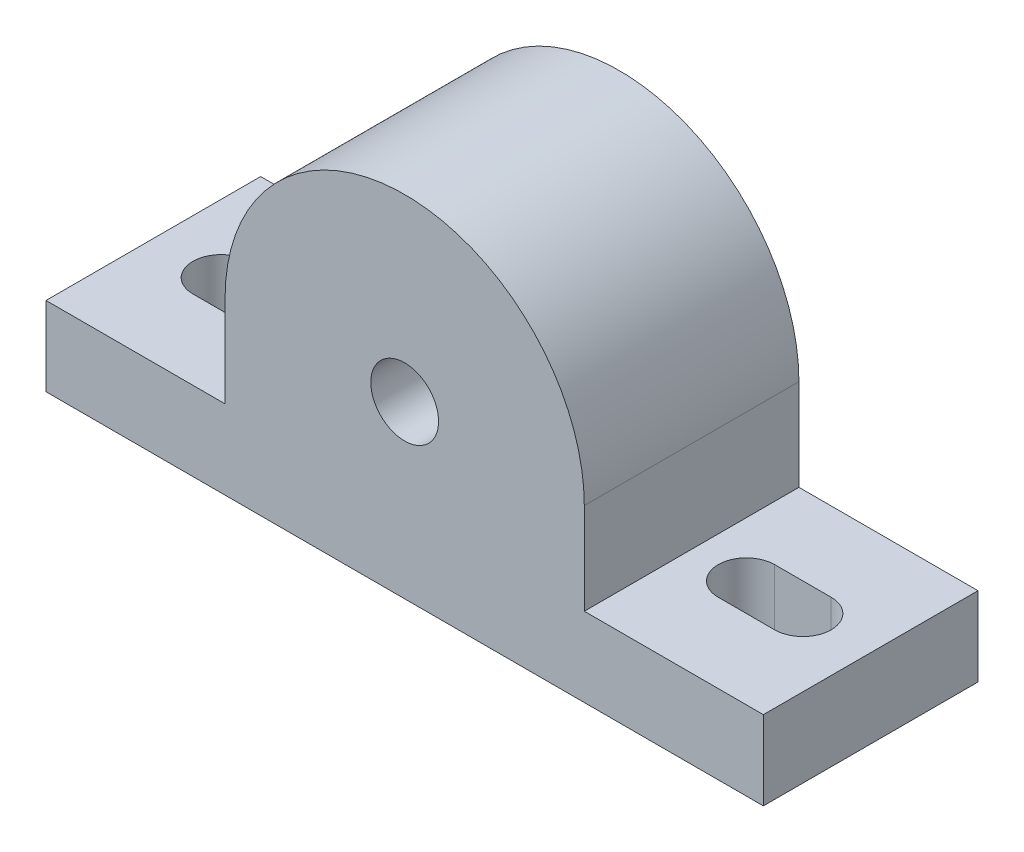
ISO-10303-21;
HEADER;
FILE_DESCRIPTION(('STEP AP214'),'2;1');
FILE_NAME('part.step','',(''),(''),'','','');
FILE_SCHEMA(('AUTOMOTIVE_DESIGN { 1 0 10303 214 1 1 1 1 }'));
ENDSEC;
DATA;
#1=APPLICATION_CONTEXT('core data for automotive mechanical design processes');
#2=APPLICATION_PROTOCOL_DEFINITION('international standard','automotive_design',2000,#1);
#3=PRODUCT_CONTEXT('',#1,'mechanical');
#4=PRODUCT('Part','Part','',(#3));
#5=PRODUCT_RELATED_PRODUCT_CATEGORY('part','',(#4));
#6=PRODUCT_DEFINITION_FORMATION('','',#4);
#7=PRODUCT_DEFINITION_CONTEXT('part definition',#1,'design');
#8=PRODUCT_DEFINITION('design','',#6,#7);
#9=PRODUCT_DEFINITION_SHAPE('','',#8);
#10=(LENGTH_UNIT() NAMED_UNIT(*) SI_UNIT(.MILLI.,.METRE.));
#11=(NAMED_UNIT(*) PLANE_ANGLE_UNIT() SI_UNIT($,.RADIAN.));
#12=(NAMED_UNIT(*) SI_UNIT($,.STERADIAN.) SOLID_ANGLE_UNIT());
#13=UNCERTAINTY_MEASURE_WITH_UNIT(LENGTH_MEASURE(1.E-05),#10,'distance_accuracy_value','');
#14=(GEOMETRIC_REPRESENTATION_CONTEXT(3) GLOBAL_UNCERTAINTY_ASSIGNED_CONTEXT((#13)) GLOBAL_UNIT_ASSIGNED_CONTEXT((#10,
#11,#12)) REPRESENTATION_CONTEXT('',''));
#15=CARTESIAN_POINT('',(0.,0.,0.));
#16=DIRECTION('',(0.,0.,1.));
#17=DIRECTION('',(1.,0.,0.));
#18=AXIS2_PLACEMENT_3D('',#15,#16,#17);
#19=CARTESIAN_POINT('',(0.,16.2,19.));
#20=DIRECTION('',(0.,0.,-1.));
#21=DIRECTION('',(-1.,0.,0.));
#22=AXIS2_PLACEMENT_3D('',#19,#20,#21);
#23=PLANE('',#22);
#24=DIRECTION('',(-1.,0.,0.));
#25=VECTOR('',#24,1.);
#26=CARTESIAN_POINT('',(-31.8,0.,19.));
#27=LINE('',#26,#25);
#28=CARTESIAN_POINT('',(-31.8,0.,19.));
#29=VERTEX_POINT('',#28);
#30=CARTESIAN_POINT('',(-63.5,0.,19.));
#31=VERTEX_POINT('',#30);
#32=EDGE_CURVE('E234',#29,#31,#27,.T.);
#33=ORIENTED_EDGE('',*,*,#32,.T.);
#34=DIRECTION('',(0.,-1.,0.));
#35=VECTOR('',#34,1.);
#36=CARTESIAN_POINT('',(-63.5,0.,19.));
#37=LINE('',#36,#35);
#38=CARTESIAN_POINT('',(-63.5,-14.,19.));
#39=VERTEX_POINT('',#38);
#40=EDGE_CURVE('E237',#31,#39,#37,.T.);
#41=ORIENTED_EDGE('',*,*,#40,.T.);
#42=DIRECTION('',(1.,0.,0.));
#43=VECTOR('',#42,1.);
#44=CARTESIAN_POINT('',(-63.5,-14.,19.));
#45=LINE('',#44,#43);
#46=CARTESIAN_POINT('',(63.5,-14.,19.));
#47=VERTEX_POINT('',#46);
#48=EDGE_CURVE('E240',#39,#47,#45,.T.);
#49=ORIENTED_EDGE('',*,*,#48,.T.);
#50=DIRECTION('',(0.,1.,0.));
#51=VECTOR('',#50,1.);
#52=CARTESIAN_POINT('',(63.5,0.,19.));
#53=LINE('',#52,#51);
#54=CARTESIAN_POINT('',(63.5,0.,19.));
#55=VERTEX_POINT('',#54);
#56=EDGE_CURVE('E242',#47,#55,#53,.T.);
#57=ORIENTED_EDGE('',*,*,#56,.T.);
#58=DIRECTION('',(-1.,0.,0.));
#59=VECTOR('',#58,1.);
#60=CARTESIAN_POINT('',(31.8,0.,19.));
#61=LINE('',#60,#59);
#62=CARTESIAN_POINT('',(31.8,0.,19.));
#63=VERTEX_POINT('',#62);
#64=EDGE_CURVE('E244',#55,#63,#61,.T.);
#65=ORIENTED_EDGE('',*,*,#64,.T.);
#66=DIRECTION('',(0.,1.,0.));
#67=VECTOR('',#66,1.);
#68=CARTESIAN_POINT('',(31.8,0.,19.));
#69=LINE('',#68,#67);
#70=CARTESIAN_POINT('',(31.8,16.2,19.));
#71=VERTEX_POINT('',#70);
#72=EDGE_CURVE('E246',#63,#71,#69,.T.);
#73=ORIENTED_EDGE('',*,*,#72,.T.);
#74=CARTESIAN_POINT('',(0.,16.2,19.));
#75=DIRECTION('',(0.,0.,1.));
#76=DIRECTION('',(-1.,0.,0.));
#77=AXIS2_PLACEMENT_3D('',#74,#75,#76);
#78=CIRCLE('',#77,31.8);
#79=CARTESIAN_POINT('',(-31.8,16.2,19.));
#80=VERTEX_POINT('',#79);
#81=EDGE_CURVE('E248',#71,#80,#78,.T.);
#82=ORIENTED_EDGE('',*,*,#81,.T.);
#83=DIRECTION('',(0.,-1.,0.));
#84=VECTOR('',#83,1.);
#85=CARTESIAN_POINT('',(-31.8,0.,19.));
#86=LINE('',#85,#84);
#87=EDGE_CURVE('E250',#80,#29,#86,.T.);
#88=ORIENTED_EDGE('',*,*,#87,.T.);
#89=EDGE_LOOP('',(#33,#41,#49,#57,#65,#73,#82,#88));
#90=FACE_BOUND('',#89,.T.);
#91=CARTESIAN_POINT('',(0.,16.2,19.));
#92=DIRECTION('',(0.,0.,1.));
#93=DIRECTION('',(-1.,0.,0.));
#94=AXIS2_PLACEMENT_3D('',#91,#92,#93);
#95=CIRCLE('',#94,6.);
#96=CARTESIAN_POINT('',(-5.99999999999999,16.2,19.));
#97=VERTEX_POINT('',#96);
#98=EDGE_CURVE('E228',#97,#97,#95,.T.);
#99=ORIENTED_EDGE('',*,*,#98,.F.);
#100=EDGE_LOOP('',(#99));
#101=FACE_BOUND('',#100,.T.);
#102=ADVANCED_FACE('F46',(#90,#101),#23,.F.);
#103=CARTESIAN_POINT('',(0.,16.2,-19.));
#104=DIRECTION('',(0.,0.,-1.));
#105=DIRECTION('',(-1.,0.,0.));
#106=AXIS2_PLACEMENT_3D('',#103,#104,#105);
#107=PLANE('',#106);
#108=DIRECTION('',(-1.,0.,0.));
#109=VECTOR('',#108,1.);
#110=CARTESIAN_POINT('',(-31.8,0.,-19.));
#111=LINE('',#110,#109);
#112=CARTESIAN_POINT('',(-31.8,0.,-19.));
#113=VERTEX_POINT('',#112);
#114=CARTESIAN_POINT('',(-63.5,0.,-19.));
#115=VERTEX_POINT('',#114);
#116=EDGE_CURVE('E231',#113,#115,#111,.T.);
#117=ORIENTED_EDGE('',*,*,#116,.F.);
#118=DIRECTION('',(0.,-1.,0.));
#119=VECTOR('',#118,1.);
#120=CARTESIAN_POINT('',(-31.8,0.,-19.));
#121=LINE('',#120,#119);
#122=CARTESIAN_POINT('',(-31.8,16.2,-19.));
#123=VERTEX_POINT('',#122);
#124=EDGE_CURVE('E238',#123,#113,#121,.T.);
#125=ORIENTED_EDGE('',*,*,#124,.F.);
#126=CARTESIAN_POINT('',(0.,16.2,-19.));
#127=DIRECTION('',(0.,0.,1.));
#128=DIRECTION('',(-1.,0.,0.));
#129=AXIS2_PLACEMENT_3D('',#126,#127,#128);
#130=CIRCLE('',#129,31.8);
#131=CARTESIAN_POINT('',(31.8,16.2,-19.));
#132=VERTEX_POINT('',#131);
#133=EDGE_CURVE('E265',#132,#123,#130,.T.);
#134=ORIENTED_EDGE('',*,*,#133,.F.);
#135=DIRECTION('',(0.,1.,0.));
#136=VECTOR('',#135,1.);
#137=CARTESIAN_POINT('',(31.8,0.,-19.));
#138=LINE('',#137,#136);
#139=CARTESIAN_POINT('',(31.8,0.,-19.));
#140=VERTEX_POINT('',#139);
#141=EDGE_CURVE('E263',#140,#132,#138,.T.);
#142=ORIENTED_EDGE('',*,*,#141,.F.);
#143=DIRECTION('',(-1.,0.,0.));
#144=VECTOR('',#143,1.);
#145=CARTESIAN_POINT('',(31.8,0.,-19.));
#146=LINE('',#145,#144);
#147=CARTESIAN_POINT('',(63.5,0.,-19.));
#148=VERTEX_POINT('',#147);
#149=EDGE_CURVE('E261',#148,#140,#146,.T.);
#150=ORIENTED_EDGE('',*,*,#149,.F.);
#151=DIRECTION('',(0.,1.,0.));
#152=VECTOR('',#151,1.);
#153=CARTESIAN_POINT('',(63.5,0.,-19.));
#154=LINE('',#153,#152);
#155=CARTESIAN_POINT('',(63.5,-14.,-19.));
#156=VERTEX_POINT('',#155);
#157=EDGE_CURVE('E259',#156,#148,#154,.T.);
#158=ORIENTED_EDGE('',*,*,#157,.F.);
#159=DIRECTION('',(1.,0.,0.));
#160=VECTOR('',#159,1.);
#161=CARTESIAN_POINT('',(-63.5,-14.,-19.));
#162=LINE('',#161,#160);
#163=CARTESIAN_POINT('',(-63.5,-14.,-19.));
#164=VERTEX_POINT('',#163);
#165=EDGE_CURVE('E257',#164,#156,#162,.T.);
#166=ORIENTED_EDGE('',*,*,#165,.F.);
#167=DIRECTION('',(0.,-1.,0.));
#168=VECTOR('',#167,1.);
#169=CARTESIAN_POINT('',(-63.5,0.,-19.));
#170=LINE('',#169,#168);
#171=EDGE_CURVE('E255',#115,#164,#170,.T.);
#172=ORIENTED_EDGE('',*,*,#171,.F.);
#173=EDGE_LOOP('',(#117,#125,#134,#142,#150,#158,#166,#172));
#174=FACE_BOUND('',#173,.T.);
#175=CARTESIAN_POINT('',(0.,16.2,-19.));
#176=DIRECTION('',(0.,0.,1.));
#177=DIRECTION('',(-1.,0.,0.));
#178=AXIS2_PLACEMENT_3D('',#175,#176,#177);
#179=CIRCLE('',#178,6.);
#180=CARTESIAN_POINT('',(-5.99999999999999,16.2,-19.));
#181=VERTEX_POINT('',#180);
#182=EDGE_CURVE('E221',#181,#181,#179,.T.);
#183=ORIENTED_EDGE('',*,*,#182,.T.);
#184=EDGE_LOOP('',(#183));
#185=FACE_BOUND('',#184,.T.);
#186=ADVANCED_FACE('F294',(#174,#185),#107,.T.);
#187=CARTESIAN_POINT('',(-31.8,0.,19.));
#188=DIRECTION('',(0.,-1.,0.));
#189=DIRECTION('',(1.,0.,0.));
#190=AXIS2_PLACEMENT_3D('',#187,#188,#189);
#191=PLANE('',#190);
#192=DIRECTION('',(1.,0.,0.));
#193=VECTOR('',#192,1.);
#194=CARTESIAN_POINT('',(-51.5,0.,5.00000000000002));
#195=LINE('',#194,#193);
#196=CARTESIAN_POINT('',(-51.5,0.,5.00000000000002));
#197=VERTEX_POINT('',#196);
#198=CARTESIAN_POINT('',(-41.5,0.,5.00000000000001));
#199=VERTEX_POINT('',#198);
#200=EDGE_CURVE('E211',#197,#199,#195,.T.);
#201=ORIENTED_EDGE('',*,*,#200,.F.);
#202=CARTESIAN_POINT('',(-51.5,0.,0.));
#203=DIRECTION('',(0.,1.,0.));
#204=DIRECTION('',(-1.,0.,0.));
#205=AXIS2_PLACEMENT_3D('',#202,#203,#204);
#206=CIRCLE('',#205,5.);
#207=CARTESIAN_POINT('',(-51.5,0.,-4.99999999999999));
#208=VERTEX_POINT('',#207);
#209=EDGE_CURVE('E192',#208,#197,#206,.T.);
#210=ORIENTED_EDGE('',*,*,#209,.F.);
#211=DIRECTION('',(-1.,0.,0.));
#212=VECTOR('',#211,1.);
#213=CARTESIAN_POINT('',(-51.5,0.,-4.99999999999999));
#214=LINE('',#213,#212);
#215=CARTESIAN_POINT('',(-41.5,0.,-4.99999999999999));
#216=VERTEX_POINT('',#215);
#217=EDGE_CURVE('E200',#216,#208,#214,.T.);
#218=ORIENTED_EDGE('',*,*,#217,.F.);
#219=CARTESIAN_POINT('',(-41.5,0.,0.));
#220=DIRECTION('',(0.,1.,0.));
#221=DIRECTION('',(-1.,0.,0.));
#222=AXIS2_PLACEMENT_3D('',#219,#220,#221);
#223=CIRCLE('',#222,5.);
#224=EDGE_CURVE('E214',#199,#216,#223,.T.);
#225=ORIENTED_EDGE('',*,*,#224,.F.);
#226=EDGE_LOOP('',(#201,#210,#218,#225));
#227=FACE_BOUND('',#226,.T.);
#228=ORIENTED_EDGE('',*,*,#116,.T.);
#229=DIRECTION('',(0.,0.,-1.));
#230=VECTOR('',#229,1.);
#231=CARTESIAN_POINT('',(-63.5,0.,19.));
#232=LINE('',#231,#230);
#233=EDGE_CURVE('E13',#31,#115,#232,.T.);
#234=ORIENTED_EDGE('',*,*,#233,.F.);
#235=ORIENTED_EDGE('',*,*,#32,.F.);
#236=DIRECTION('',(0.,0.,-1.));
#237=VECTOR('',#236,1.);
#238=CARTESIAN_POINT('',(-31.8,0.,19.));
#239=LINE('',#238,#237);
#240=EDGE_CURVE('E252',#29,#113,#239,.T.);
#241=ORIENTED_EDGE('',*,*,#240,.T.);
#242=EDGE_LOOP('',(#228,#234,#235,#241));
#243=FACE_BOUND('',#242,.T.);
#244=ADVANCED_FACE('F48',(#227,#243),#191,.F.);
#245=CARTESIAN_POINT('',(-63.5,0.,19.));
#246=DIRECTION('',(1.,0.,0.));
#247=DIRECTION('',(0.,0.,-1.));
#248=AXIS2_PLACEMENT_3D('',#245,#246,#247);
#249=PLANE('',#248);
#250=ORIENTED_EDGE('',*,*,#171,.T.);
#251=DIRECTION('',(0.,0.,-1.));
#252=VECTOR('',#251,1.);
#253=CARTESIAN_POINT('',(-63.5,-14.,19.));
#254=LINE('',#253,#252);
#255=EDGE_CURVE('E54',#39,#164,#254,.T.);
#256=ORIENTED_EDGE('',*,*,#255,.F.);
#257=ORIENTED_EDGE('',*,*,#40,.F.);
#258=ORIENTED_EDGE('',*,*,#233,.T.);
#259=EDGE_LOOP('',(#250,#256,#257,#258));
#260=FACE_BOUND('',#259,.T.);
#261=ADVANCED_FACE('F312',(#260),#249,.F.);
#262=CARTESIAN_POINT('',(-63.5,-14.,19.));
#263=DIRECTION('',(0.,1.,0.));
#264=DIRECTION('',(-1.,0.,0.));
#265=AXIS2_PLACEMENT_3D('',#262,#263,#264);
#266=PLANE('',#265);
#267=DIRECTION('',(1.,0.,0.));
#268=VECTOR('',#267,1.);
#269=CARTESIAN_POINT('',(51.5,-14.,5.00000000000003));
#270=LINE('',#269,#268);
#271=CARTESIAN_POINT('',(41.5,-14.,5.00000000000003));
#272=VERTEX_POINT('',#271);
#273=CARTESIAN_POINT('',(51.5,-14.,5.00000000000003));
#274=VERTEX_POINT('',#273);
#275=EDGE_CURVE('E167',#272,#274,#270,.T.);
#276=ORIENTED_EDGE('',*,*,#275,.T.);
#277=CARTESIAN_POINT('',(51.5,-14.,0.));
#278=DIRECTION('',(0.,1.,0.));
#279=DIRECTION('',(1.,0.,0.));
#280=AXIS2_PLACEMENT_3D('',#277,#278,#279);
#281=CIRCLE('',#280,4.99999999999999);
#282=CARTESIAN_POINT('',(51.5,-14.,-4.99999999999996));
#283=VERTEX_POINT('',#282);
#284=EDGE_CURVE('E161',#274,#283,#281,.T.);
#285=ORIENTED_EDGE('',*,*,#284,.T.);
#286=DIRECTION('',(-1.,0.,0.));
#287=VECTOR('',#286,1.);
#288=CARTESIAN_POINT('',(51.5,-14.,-4.99999999999996));
#289=LINE('',#288,#287);
#290=CARTESIAN_POINT('',(41.5,-14.,-4.99999999999996));
#291=VERTEX_POINT('',#290);
#292=EDGE_CURVE('E170',#283,#291,#289,.T.);
#293=ORIENTED_EDGE('',*,*,#292,.T.);
#294=CARTESIAN_POINT('',(41.5,-14.,0.));
#295=DIRECTION('',(0.,1.,0.));
#296=DIRECTION('',(1.,0.,0.));
#297=AXIS2_PLACEMENT_3D('',#294,#295,#296);
#298=CIRCLE('',#297,4.99999999999999);
#299=EDGE_CURVE('E61',#291,#272,#298,.T.);
#300=ORIENTED_EDGE('',*,*,#299,.T.);
#301=EDGE_LOOP('',(#276,#285,#293,#300));
#302=FACE_BOUND('',#301,.T.);
#303=DIRECTION('',(-1.,0.,0.));
#304=VECTOR('',#303,1.);
#305=CARTESIAN_POINT('',(-51.5,-14.,-4.99999999999999));
#306=LINE('',#305,#304);
#307=CARTESIAN_POINT('',(-41.5,-14.,-4.99999999999999));
#308=VERTEX_POINT('',#307);
#309=CARTESIAN_POINT('',(-51.5,-14.,-4.99999999999999));
#310=VERTEX_POINT('',#309);
#311=EDGE_CURVE('E206',#308,#310,#306,.T.);
#312=ORIENTED_EDGE('',*,*,#311,.T.);
#313=CARTESIAN_POINT('',(-51.5,-14.,0.));
#314=DIRECTION('',(0.,1.,0.));
#315=DIRECTION('',(-1.,0.,0.));
#316=AXIS2_PLACEMENT_3D('',#313,#314,#315);
#317=CIRCLE('',#316,5.);
#318=CARTESIAN_POINT('',(-51.5,-14.,5.00000000000002));
#319=VERTEX_POINT('',#318);
#320=EDGE_CURVE('E196',#310,#319,#317,.T.);
#321=ORIENTED_EDGE('',*,*,#320,.T.);
#322=DIRECTION('',(1.,0.,0.));
#323=VECTOR('',#322,1.);
#324=CARTESIAN_POINT('',(-51.5,-14.,5.00000000000002));
#325=LINE('',#324,#323);
#326=CARTESIAN_POINT('',(-41.5,-14.,5.00000000000001));
#327=VERTEX_POINT('',#326);
#328=EDGE_CURVE('E199',#319,#327,#325,.T.);
#329=ORIENTED_EDGE('',*,*,#328,.T.);
#330=CARTESIAN_POINT('',(-41.5,-14.,0.));
#331=DIRECTION('',(0.,1.,0.));
#332=DIRECTION('',(-1.,0.,0.));
#333=AXIS2_PLACEMENT_3D('',#330,#331,#332);
#334=CIRCLE('',#333,5.);
#335=EDGE_CURVE('E203',#327,#308,#334,.T.);
#336=ORIENTED_EDGE('',*,*,#335,.T.);
#337=EDGE_LOOP('',(#312,#321,#329,#336));
#338=FACE_BOUND('',#337,.T.);
#339=ORIENTED_EDGE('',*,*,#165,.T.);
#340=DIRECTION('',(0.,0.,-1.));
#341=VECTOR('',#340,1.);
#342=CARTESIAN_POINT('',(63.5,-14.,19.));
#343=LINE('',#342,#341);
#344=EDGE_CURVE('E282',#47,#156,#343,.T.);
#345=ORIENTED_EDGE('',*,*,#344,.F.);
#346=ORIENTED_EDGE('',*,*,#48,.F.);
#347=ORIENTED_EDGE('',*,*,#255,.T.);
#348=EDGE_LOOP('',(#339,#345,#346,#347));
#349=FACE_BOUND('',#348,.T.);
#350=ADVANCED_FACE('F174',(#302,#338,#349),#266,.F.);
#351=CARTESIAN_POINT('',(63.5,0.,19.));
#352=DIRECTION('',(-1.,0.,0.));
#353=DIRECTION('',(0.,-1.,0.));
#354=AXIS2_PLACEMENT_3D('',#351,#352,#353);
#355=PLANE('',#354);
#356=ORIENTED_EDGE('',*,*,#157,.T.);
#357=DIRECTION('',(0.,0.,-1.));
#358=VECTOR('',#357,1.);
#359=CARTESIAN_POINT('',(63.5,0.,19.));
#360=LINE('',#359,#358);
#361=EDGE_CURVE('E279',#55,#148,#360,.T.);
#362=ORIENTED_EDGE('',*,*,#361,.F.);
#363=ORIENTED_EDGE('',*,*,#56,.F.);
#364=ORIENTED_EDGE('',*,*,#344,.T.);
#365=EDGE_LOOP('',(#356,#362,#363,#364));
#366=FACE_BOUND('',#365,.T.);
#367=ADVANCED_FACE('F300',(#366),#355,.F.);
#368=CARTESIAN_POINT('',(31.8,0.,19.));
#369=DIRECTION('',(0.,-1.,0.));
#370=DIRECTION('',(1.,0.,0.));
#371=AXIS2_PLACEMENT_3D('',#368,#369,#370);
#372=PLANE('',#371);
#373=DIRECTION('',(-1.,0.,0.));
#374=VECTOR('',#373,1.);
#375=CARTESIAN_POINT('',(51.5,0.,-4.99999999999996));
#376=LINE('',#375,#374);
#377=CARTESIAN_POINT('',(51.5,0.,-4.99999999999996));
#378=VERTEX_POINT('',#377);
#379=CARTESIAN_POINT('',(41.5,0.,-4.99999999999996));
#380=VERTEX_POINT('',#379);
#381=EDGE_CURVE('E186',#378,#380,#376,.T.);
#382=ORIENTED_EDGE('',*,*,#381,.F.);
#383=CARTESIAN_POINT('',(51.5,0.,0.));
#384=DIRECTION('',(0.,1.,0.));
#385=DIRECTION('',(1.,0.,0.));
#386=AXIS2_PLACEMENT_3D('',#383,#384,#385);
#387=CIRCLE('',#386,4.99999999999999);
#388=CARTESIAN_POINT('',(51.5,0.,5.00000000000003));
#389=VERTEX_POINT('',#388);
#390=EDGE_CURVE('E69',#389,#378,#387,.T.);
#391=ORIENTED_EDGE('',*,*,#390,.F.);
#392=DIRECTION('',(1.,0.,0.));
#393=VECTOR('',#392,1.);
#394=CARTESIAN_POINT('',(51.5,0.,5.00000000000003));
#395=LINE('',#394,#393);
#396=CARTESIAN_POINT('',(41.5,0.,5.00000000000003));
#397=VERTEX_POINT('',#396);
#398=EDGE_CURVE('E177',#397,#389,#395,.T.);
#399=ORIENTED_EDGE('',*,*,#398,.F.);
#400=CARTESIAN_POINT('',(41.5,0.,0.));
#401=DIRECTION('',(0.,1.,0.));
#402=DIRECTION('',(1.,0.,0.));
#403=AXIS2_PLACEMENT_3D('',#400,#401,#402);
#404=CIRCLE('',#403,4.99999999999999);
#405=EDGE_CURVE('E180',#380,#397,#404,.T.);
#406=ORIENTED_EDGE('',*,*,#405,.F.);
#407=EDGE_LOOP('',(#382,#391,#399,#406));
#408=FACE_BOUND('',#407,.T.);
#409=ORIENTED_EDGE('',*,*,#149,.T.);
#410=DIRECTION('',(0.,0.,-1.));
#411=VECTOR('',#410,1.);
#412=CARTESIAN_POINT('',(31.8,0.,19.));
#413=LINE('',#412,#411);
#414=EDGE_CURVE('E276',#63,#140,#413,.T.);
#415=ORIENTED_EDGE('',*,*,#414,.F.);
#416=ORIENTED_EDGE('',*,*,#64,.F.);
#417=ORIENTED_EDGE('',*,*,#361,.T.);
#418=EDGE_LOOP('',(#409,#415,#416,#417));
#419=FACE_BOUND('',#418,.T.);
#420=ADVANCED_FACE('F304',(#408,#419),#372,.F.);
#421=CARTESIAN_POINT('',(31.8,0.,19.));
#422=DIRECTION('',(-1.,0.,0.));
#423=DIRECTION('',(0.,0.,1.));
#424=AXIS2_PLACEMENT_3D('',#421,#422,#423);
#425=PLANE('',#424);
#426=ORIENTED_EDGE('',*,*,#141,.T.);
#427=DIRECTION('',(0.,0.,-1.));
#428=VECTOR('',#427,1.);
#429=CARTESIAN_POINT('',(31.8,16.2,19.));
#430=LINE('',#429,#428);
#431=EDGE_CURVE('E273',#71,#132,#430,.T.);
#432=ORIENTED_EDGE('',*,*,#431,.F.);
#433=ORIENTED_EDGE('',*,*,#72,.F.);
#434=ORIENTED_EDGE('',*,*,#414,.T.);
#435=EDGE_LOOP('',(#426,#432,#433,#434));
#436=FACE_BOUND('',#435,.T.);
#437=ADVANCED_FACE('F325',(#436),#425,.F.);
#438=CARTESIAN_POINT('',(0.,16.2,19.));
#439=DIRECTION('',(0.,0.,-1.));
#440=DIRECTION('',(-1.,0.,0.));
#441=AXIS2_PLACEMENT_3D('',#438,#439,#440);
#442=CYLINDRICAL_SURFACE('',#441,31.8);
#443=ORIENTED_EDGE('',*,*,#133,.T.);
#444=DIRECTION('',(0.,0.,-1.));
#445=VECTOR('',#444,1.);
#446=CARTESIAN_POINT('',(-31.8,16.2,19.));
#447=LINE('',#446,#445);
#448=EDGE_CURVE('E270',#80,#123,#447,.T.);
#449=ORIENTED_EDGE('',*,*,#448,.F.);
#450=ORIENTED_EDGE('',*,*,#81,.F.);
#451=ORIENTED_EDGE('',*,*,#431,.T.);
#452=EDGE_LOOP('',(#443,#449,#450,#451));
#453=FACE_BOUND('',#452,.T.);
#454=ADVANCED_FACE('F323',(#453),#442,.T.);
#455=CARTESIAN_POINT('',(-31.8,0.,19.));
#456=DIRECTION('',(1.,0.,0.));
#457=DIRECTION('',(0.,0.,-1.));
#458=AXIS2_PLACEMENT_3D('',#455,#456,#457);
#459=PLANE('',#458);
#460=ORIENTED_EDGE('',*,*,#124,.T.);
#461=ORIENTED_EDGE('',*,*,#240,.F.);
#462=ORIENTED_EDGE('',*,*,#87,.F.);
#463=ORIENTED_EDGE('',*,*,#448,.T.);
#464=EDGE_LOOP('',(#460,#461,#462,#463));
#465=FACE_BOUND('',#464,.T.);
#466=ADVANCED_FACE('F318',(#465),#459,.F.);
#467=CARTESIAN_POINT('',(0.,16.2,19.));
#468=DIRECTION('',(0.,0.,-1.));
#469=DIRECTION('',(-1.,0.,0.));
#470=AXIS2_PLACEMENT_3D('',#467,#468,#469);
#471=CYLINDRICAL_SURFACE('',#470,6.);
#472=ORIENTED_EDGE('',*,*,#98,.T.);
#473=EDGE_LOOP('',(#472));
#474=FACE_BOUND('',#473,.T.);
#475=ORIENTED_EDGE('',*,*,#182,.F.);
#476=EDGE_LOOP('',(#475));
#477=FACE_BOUND('',#476,.T.);
#478=ADVANCED_FACE('F343',(#474,#477),#471,.F.);
#479=CARTESIAN_POINT('',(-51.5,-14.,0.));
#480=DIRECTION('',(0.,1.,0.));
#481=DIRECTION('',(-1.,0.,0.));
#482=AXIS2_PLACEMENT_3D('',#479,#480,#481);
#483=CYLINDRICAL_SURFACE('',#482,5.);
#484=ORIENTED_EDGE('',*,*,#209,.T.);
#485=DIRECTION('',(0.,1.,0.));
#486=VECTOR('',#485,1.);
#487=CARTESIAN_POINT('',(-51.5,-14.,5.00000000000002));
#488=LINE('',#487,#486);
#489=EDGE_CURVE('E209',#319,#197,#488,.T.);
#490=ORIENTED_EDGE('',*,*,#489,.F.);
#491=ORIENTED_EDGE('',*,*,#320,.F.);
#492=DIRECTION('',(0.,1.,0.));
#493=VECTOR('',#492,1.);
#494=CARTESIAN_POINT('',(-51.5,-14.,-4.99999999999999));
#495=LINE('',#494,#493);
#496=EDGE_CURVE('E219',#310,#208,#495,.T.);
#497=ORIENTED_EDGE('',*,*,#496,.T.);
#498=EDGE_LOOP('',(#484,#490,#491,#497));
#499=FACE_BOUND('',#498,.T.);
#500=ADVANCED_FACE('F350',(#499),#483,.F.);
#501=CARTESIAN_POINT('',(-51.5,-14.,-4.99999999999999));
#502=DIRECTION('',(0.,0.,-1.));
#503=DIRECTION('',(-1.,0.,0.));
#504=AXIS2_PLACEMENT_3D('',#501,#502,#503);
#505=PLANE('',#504);
#506=ORIENTED_EDGE('',*,*,#217,.T.);
#507=ORIENTED_EDGE('',*,*,#496,.F.);
#508=ORIENTED_EDGE('',*,*,#311,.F.);
#509=DIRECTION('',(0.,1.,0.));
#510=VECTOR('',#509,1.);
#511=CARTESIAN_POINT('',(-41.5,-14.,-4.99999999999999));
#512=LINE('',#511,#510);
#513=EDGE_CURVE('E222',#308,#216,#512,.T.);
#514=ORIENTED_EDGE('',*,*,#513,.T.);
#515=EDGE_LOOP('',(#506,#507,#508,#514));
#516=FACE_BOUND('',#515,.T.);
#517=ADVANCED_FACE('F355',(#516),#505,.F.);
#518=CARTESIAN_POINT('',(-41.5,-14.,0.));
#519=DIRECTION('',(0.,1.,0.));
#520=DIRECTION('',(-1.,0.,0.));
#521=AXIS2_PLACEMENT_3D('',#518,#519,#520);
#522=CYLINDRICAL_SURFACE('',#521,5.);
#523=ORIENTED_EDGE('',*,*,#224,.T.);
#524=ORIENTED_EDGE('',*,*,#513,.F.);
#525=ORIENTED_EDGE('',*,*,#335,.F.);
#526=DIRECTION('',(0.,1.,0.));
#527=VECTOR('',#526,1.);
#528=CARTESIAN_POINT('',(-41.5,-14.,5.00000000000001));
#529=LINE('',#528,#527);
#530=EDGE_CURVE('E224',#327,#199,#529,.T.);
#531=ORIENTED_EDGE('',*,*,#530,.T.);
#532=EDGE_LOOP('',(#523,#524,#525,#531));
#533=FACE_BOUND('',#532,.T.);
#534=ADVANCED_FACE('F363',(#533),#522,.F.);
#535=CARTESIAN_POINT('',(-51.5,-14.,5.00000000000002));
#536=DIRECTION('',(0.,0.,1.));
#537=DIRECTION('',(1.,0.,0.));
#538=AXIS2_PLACEMENT_3D('',#535,#536,#537);
#539=PLANE('',#538);
#540=ORIENTED_EDGE('',*,*,#200,.T.);
#541=ORIENTED_EDGE('',*,*,#530,.F.);
#542=ORIENTED_EDGE('',*,*,#328,.F.);
#543=ORIENTED_EDGE('',*,*,#489,.T.);
#544=EDGE_LOOP('',(#540,#541,#542,#543));
#545=FACE_BOUND('',#544,.T.);
#546=ADVANCED_FACE('F367',(#545),#539,.F.);
#547=CARTESIAN_POINT('',(51.5,-14.,0.));
#548=DIRECTION('',(0.,1.,0.));
#549=DIRECTION('',(-1.,0.,0.));
#550=AXIS2_PLACEMENT_3D('',#547,#548,#549);
#551=CYLINDRICAL_SURFACE('',#550,4.99999999999999);
#552=ORIENTED_EDGE('',*,*,#390,.T.);
#553=DIRECTION('',(0.,1.,0.));
#554=VECTOR('',#553,1.);
#555=CARTESIAN_POINT('',(51.5,-14.,-4.99999999999996));
#556=LINE('',#555,#554);
#557=EDGE_CURVE('E157',#283,#378,#556,.T.);
#558=ORIENTED_EDGE('',*,*,#557,.F.);
#559=ORIENTED_EDGE('',*,*,#284,.F.);
#560=DIRECTION('',(0.,1.,0.));
#561=VECTOR('',#560,1.);
#562=CARTESIAN_POINT('',(51.5,-14.,5.00000000000003));
#563=LINE('',#562,#561);
#564=EDGE_CURVE('E190',#274,#389,#563,.T.);
#565=ORIENTED_EDGE('',*,*,#564,.T.);
#566=EDGE_LOOP('',(#552,#558,#559,#565));
#567=FACE_BOUND('',#566,.T.);
#568=ADVANCED_FACE('F159',(#567),#551,.F.);
#569=CARTESIAN_POINT('',(51.5,-14.,5.00000000000003));
#570=DIRECTION('',(0.,0.,1.));
#571=DIRECTION('',(1.,0.,0.));
#572=AXIS2_PLACEMENT_3D('',#569,#570,#571);
#573=PLANE('',#572);
#574=ORIENTED_EDGE('',*,*,#398,.T.);
#575=ORIENTED_EDGE('',*,*,#564,.F.);
#576=ORIENTED_EDGE('',*,*,#275,.F.);
#577=DIRECTION('',(0.,1.,0.));
#578=VECTOR('',#577,1.);
#579=CARTESIAN_POINT('',(41.5,-14.,5.00000000000003));
#580=LINE('',#579,#578);
#581=EDGE_CURVE('E193',#272,#397,#580,.T.);
#582=ORIENTED_EDGE('',*,*,#581,.T.);
#583=EDGE_LOOP('',(#574,#575,#576,#582));
#584=FACE_BOUND('',#583,.T.);
#585=ADVANCED_FACE('F376',(#584),#573,.F.);
#586=CARTESIAN_POINT('',(41.5,-14.,0.));
#587=DIRECTION('',(0.,1.,0.));
#588=DIRECTION('',(-1.,0.,0.));
#589=AXIS2_PLACEMENT_3D('',#586,#587,#588);
#590=CYLINDRICAL_SURFACE('',#589,4.99999999999999);
#591=ORIENTED_EDGE('',*,*,#405,.T.);
#592=ORIENTED_EDGE('',*,*,#581,.F.);
#593=ORIENTED_EDGE('',*,*,#299,.F.);
#594=DIRECTION('',(0.,1.,0.));
#595=VECTOR('',#594,1.);
#596=CARTESIAN_POINT('',(41.5,-14.,-4.99999999999996));
#597=LINE('',#596,#595);
#598=EDGE_CURVE('E166',#291,#380,#597,.T.);
#599=ORIENTED_EDGE('',*,*,#598,.T.);
#600=EDGE_LOOP('',(#591,#592,#593,#599));
#601=FACE_BOUND('',#600,.T.);
#602=ADVANCED_FACE('F379',(#601),#590,.F.);
#603=CARTESIAN_POINT('',(51.5,-14.,-4.99999999999996));
#604=DIRECTION('',(0.,0.,-1.));
#605=DIRECTION('',(-1.,0.,0.));
#606=AXIS2_PLACEMENT_3D('',#603,#604,#605);
#607=PLANE('',#606);
#608=ORIENTED_EDGE('',*,*,#381,.T.);
#609=ORIENTED_EDGE('',*,*,#598,.F.);
#610=ORIENTED_EDGE('',*,*,#292,.F.);
#611=ORIENTED_EDGE('',*,*,#557,.T.);
#612=EDGE_LOOP('',(#608,#609,#610,#611));
#613=FACE_BOUND('',#612,.T.);
#614=ADVANCED_FACE('F171',(#613),#607,.F.);
#615=CLOSED_SHELL('',(#102,#186,#244,#261,#350,#367,#420,#437,#454,#466,#478,#500,#517,#534,
#546,#568,#585,#602,#614));
#616=MANIFOLD_SOLID_BREP('B2',#615);
#617=ADVANCED_BREP_SHAPE_REPRESENTATION('',(#18,#616),#14);
#618=SHAPE_DEFINITION_REPRESENTATION(#9,#617);
ENDSEC;
END-ISO-10303-21;
